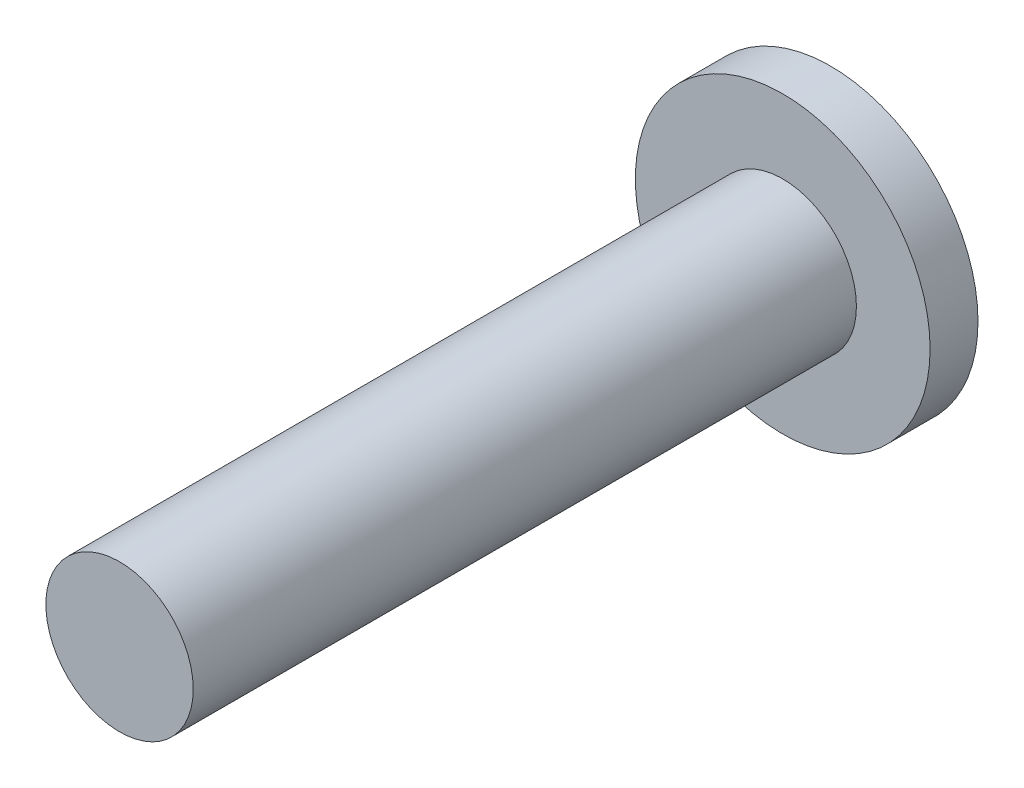
ISO-10303-21;
HEADER;
FILE_DESCRIPTION(('STEP AP214'),'2;1');
FILE_NAME('part.step','',(''),(''),'','','');
FILE_SCHEMA(('AUTOMOTIVE_DESIGN { 1 0 10303 214 1 1 1 1 }'));
ENDSEC;
DATA;
#1=APPLICATION_CONTEXT('core data for automotive mechanical design processes');
#2=APPLICATION_PROTOCOL_DEFINITION('international standard','automotive_design',2000,#1);
#3=PRODUCT_CONTEXT('',#1,'mechanical');
#4=PRODUCT('Part','Part','',(#3));
#5=PRODUCT_RELATED_PRODUCT_CATEGORY('part','',(#4));
#6=PRODUCT_DEFINITION_FORMATION('','',#4);
#7=PRODUCT_DEFINITION_CONTEXT('part definition',#1,'design');
#8=PRODUCT_DEFINITION('design','',#6,#7);
#9=PRODUCT_DEFINITION_SHAPE('','',#8);
#10=(LENGTH_UNIT() NAMED_UNIT(*) SI_UNIT(.MILLI.,.METRE.));
#11=(NAMED_UNIT(*) PLANE_ANGLE_UNIT() SI_UNIT($,.RADIAN.));
#12=(NAMED_UNIT(*) SI_UNIT($,.STERADIAN.) SOLID_ANGLE_UNIT());
#13=UNCERTAINTY_MEASURE_WITH_UNIT(LENGTH_MEASURE(1.E-05),#10,'distance_accuracy_value','');
#14=(GEOMETRIC_REPRESENTATION_CONTEXT(3) GLOBAL_UNCERTAINTY_ASSIGNED_CONTEXT((#13)) GLOBAL_UNIT_ASSIGNED_CONTEXT((#10,
#11,#12)) REPRESENTATION_CONTEXT('',''));
#15=CARTESIAN_POINT('',(0.,0.,0.));
#16=DIRECTION('',(0.,0.,1.));
#17=DIRECTION('',(1.,0.,0.));
#18=AXIS2_PLACEMENT_3D('',#15,#16,#17);
#19=CARTESIAN_POINT('',(0.,0.,1.3));
#20=DIRECTION('',(0.,0.,-1.));
#21=DIRECTION('',(-1.,0.,0.));
#22=AXIS2_PLACEMENT_3D('',#19,#20,#21);
#23=CYLINDRICAL_SURFACE('',#22,4.);
#24=CARTESIAN_POINT('',(0.,0.,1.3));
#25=DIRECTION('',(0.,0.,1.));
#26=DIRECTION('',(1.,0.,0.));
#27=AXIS2_PLACEMENT_3D('',#24,#25,#26);
#28=CIRCLE('',#27,4.);
#29=CARTESIAN_POINT('',(4.,0.,1.3));
#30=VERTEX_POINT('',#29);
#31=EDGE_CURVE('E48',#30,#30,#28,.T.);
#32=ORIENTED_EDGE('',*,*,#31,.F.);
#33=EDGE_LOOP('',(#32));
#34=FACE_BOUND('',#33,.T.);
#35=CARTESIAN_POINT('',(0.,0.,0.));
#36=DIRECTION('',(0.,0.,1.));
#37=DIRECTION('',(1.,0.,0.));
#38=AXIS2_PLACEMENT_3D('',#35,#36,#37);
#39=CIRCLE('',#38,4.);
#40=CARTESIAN_POINT('',(4.,0.,0.));
#41=VERTEX_POINT('',#40);
#42=EDGE_CURVE('E43',#41,#41,#39,.T.);
#43=ORIENTED_EDGE('',*,*,#42,.T.);
#44=EDGE_LOOP('',(#43));
#45=FACE_BOUND('',#44,.T.);
#46=ADVANCED_FACE('F40',(#34,#45),#23,.T.);
#47=CARTESIAN_POINT('',(0.,0.,1.3));
#48=DIRECTION('',(0.,0.,1.));
#49=DIRECTION('',(1.,0.,0.));
#50=AXIS2_PLACEMENT_3D('',#47,#48,#49);
#51=PLANE('',#50);
#52=CARTESIAN_POINT('',(0.,0.,1.3));
#53=DIRECTION('',(0.,0.,1.));
#54=DIRECTION('',(1.,0.,0.));
#55=AXIS2_PLACEMENT_3D('',#52,#53,#54);
#56=CIRCLE('',#55,2.);
#57=CARTESIAN_POINT('',(2.,0.,1.3));
#58=VERTEX_POINT('',#57);
#59=EDGE_CURVE('E11',#58,#58,#56,.T.);
#60=ORIENTED_EDGE('',*,*,#59,.F.);
#61=EDGE_LOOP('',(#60));
#62=FACE_BOUND('',#61,.T.);
#63=ORIENTED_EDGE('',*,*,#31,.T.);
#64=EDGE_LOOP('',(#63));
#65=FACE_BOUND('',#64,.T.);
#66=ADVANCED_FACE('F160',(#62,#65),#51,.T.);
#67=CARTESIAN_POINT('',(0.,0.,0.));
#68=DIRECTION('',(0.,0.,1.));
#69=DIRECTION('',(1.,0.,0.));
#70=AXIS2_PLACEMENT_3D('',#67,#68,#69);
#71=PLANE('',#70);
#72=DIRECTION('',(0.5,0.866025403784439,0.));
#73=VECTOR('',#72,1.);
#74=CARTESIAN_POINT('',(-1.44337567297406,0.,0.));
#75=LINE('',#74,#73);
#76=CARTESIAN_POINT('',(-1.44337567297406,0.,0.));
#77=VERTEX_POINT('',#76);
#78=CARTESIAN_POINT('',(-0.721687836487032,1.25,0.));
#79=VERTEX_POINT('',#78);
#80=EDGE_CURVE('E130',#77,#79,#75,.T.);
#81=ORIENTED_EDGE('',*,*,#80,.F.);
#82=DIRECTION('',(-0.5,0.866025403784439,0.));
#83=VECTOR('',#82,1.);
#84=CARTESIAN_POINT('',(-0.721687836487032,-1.25,0.));
#85=LINE('',#84,#83);
#86=CARTESIAN_POINT('',(-0.721687836487032,-1.25,0.));
#87=VERTEX_POINT('',#86);
#88=EDGE_CURVE('E56',#87,#77,#85,.T.);
#89=ORIENTED_EDGE('',*,*,#88,.F.);
#90=DIRECTION('',(-1.,0.,0.));
#91=VECTOR('',#90,1.);
#92=CARTESIAN_POINT('',(0.721687836487033,-1.25,0.));
#93=LINE('',#92,#91);
#94=CARTESIAN_POINT('',(0.721687836487033,-1.25,0.));
#95=VERTEX_POINT('',#94);
#96=EDGE_CURVE('E139',#95,#87,#93,.T.);
#97=ORIENTED_EDGE('',*,*,#96,.F.);
#98=DIRECTION('',(-0.5,-0.866025403784439,0.));
#99=VECTOR('',#98,1.);
#100=CARTESIAN_POINT('',(1.44337567297406,0.,0.));
#101=LINE('',#100,#99);
#102=CARTESIAN_POINT('',(1.44337567297406,0.,0.));
#103=VERTEX_POINT('',#102);
#104=EDGE_CURVE('E137',#103,#95,#101,.T.);
#105=ORIENTED_EDGE('',*,*,#104,.F.);
#106=DIRECTION('',(0.5,-0.866025403784439,0.));
#107=VECTOR('',#106,1.);
#108=CARTESIAN_POINT('',(0.721687836487033,1.25,0.));
#109=LINE('',#108,#107);
#110=CARTESIAN_POINT('',(0.721687836487033,1.25,0.));
#111=VERTEX_POINT('',#110);
#112=EDGE_CURVE('E104',#111,#103,#109,.T.);
#113=ORIENTED_EDGE('',*,*,#112,.F.);
#114=DIRECTION('',(1.,0.,0.));
#115=VECTOR('',#114,1.);
#116=CARTESIAN_POINT('',(-0.721687836487032,1.25,0.));
#117=LINE('',#116,#115);
#118=EDGE_CURVE('E133',#79,#111,#117,.T.);
#119=ORIENTED_EDGE('',*,*,#118,.F.);
#120=EDGE_LOOP('',(#81,#89,#97,#105,#113,#119));
#121=FACE_BOUND('',#120,.T.);
#122=ORIENTED_EDGE('',*,*,#42,.F.);
#123=EDGE_LOOP('',(#122));
#124=FACE_BOUND('',#123,.T.);
#125=ADVANCED_FACE('F157',(#121,#124),#71,.F.);
#126=CARTESIAN_POINT('',(0.,0.,19.3));
#127=DIRECTION('',(0.,0.,-1.));
#128=DIRECTION('',(-1.,0.,0.));
#129=AXIS2_PLACEMENT_3D('',#126,#127,#128);
#130=CYLINDRICAL_SURFACE('',#129,2.);
#131=CARTESIAN_POINT('',(0.,0.,19.3));
#132=DIRECTION('',(0.,0.,1.));
#133=DIRECTION('',(1.,0.,0.));
#134=AXIS2_PLACEMENT_3D('',#131,#132,#133);
#135=CIRCLE('',#134,2.);
#136=CARTESIAN_POINT('',(2.,0.,19.3));
#137=VERTEX_POINT('',#136);
#138=EDGE_CURVE('E143',#137,#137,#135,.T.);
#139=ORIENTED_EDGE('',*,*,#138,.F.);
#140=EDGE_LOOP('',(#139));
#141=FACE_BOUND('',#140,.T.);
#142=ORIENTED_EDGE('',*,*,#59,.T.);
#143=EDGE_LOOP('',(#142));
#144=FACE_BOUND('',#143,.T.);
#145=ADVANCED_FACE('F159',(#141,#144),#130,.T.);
#146=CARTESIAN_POINT('',(0.,0.,19.3));
#147=DIRECTION('',(0.,0.,1.));
#148=DIRECTION('',(1.,0.,0.));
#149=AXIS2_PLACEMENT_3D('',#146,#147,#148);
#150=PLANE('',#149);
#151=ORIENTED_EDGE('',*,*,#138,.T.);
#152=EDGE_LOOP('',(#151));
#153=FACE_BOUND('',#152,.T.);
#154=ADVANCED_FACE('F167',(#153),#150,.T.);
#155=CARTESIAN_POINT('',(-0.721687836487032,-1.25,1.));
#156=DIRECTION('',(-0.866025403784439,-0.5,0.));
#157=DIRECTION('',(0.5,-0.866025403784439,0.));
#158=AXIS2_PLACEMENT_3D('',#155,#156,#157);
#159=PLANE('',#158);
#160=ORIENTED_EDGE('',*,*,#88,.T.);
#161=DIRECTION('',(0.,0.,-1.));
#162=VECTOR('',#161,1.);
#163=CARTESIAN_POINT('',(-1.44337567297406,0.,1.));
#164=LINE('',#163,#162);
#165=CARTESIAN_POINT('',(-1.44337567297406,0.,1.));
#166=VERTEX_POINT('',#165);
#167=EDGE_CURVE('E86',#166,#77,#164,.T.);
#168=ORIENTED_EDGE('',*,*,#167,.F.);
#169=DIRECTION('',(-0.5,0.866025403784439,0.));
#170=VECTOR('',#169,1.);
#171=CARTESIAN_POINT('',(-0.721687836487032,-1.25,1.));
#172=LINE('',#171,#170);
#173=CARTESIAN_POINT('',(-0.721687836487032,-1.25,1.));
#174=VERTEX_POINT('',#173);
#175=EDGE_CURVE('E141',#174,#166,#172,.T.);
#176=ORIENTED_EDGE('',*,*,#175,.F.);
#177=DIRECTION('',(0.,0.,-1.));
#178=VECTOR('',#177,1.);
#179=CARTESIAN_POINT('',(-0.721687836487032,-1.25,1.));
#180=LINE('',#179,#178);
#181=EDGE_CURVE('E64',#174,#87,#180,.T.);
#182=ORIENTED_EDGE('',*,*,#181,.T.);
#183=EDGE_LOOP('',(#160,#168,#176,#182));
#184=FACE_BOUND('',#183,.T.);
#185=ADVANCED_FACE('F193',(#184),#159,.F.);
#186=CARTESIAN_POINT('',(0.721687836487033,-1.25,1.));
#187=DIRECTION('',(0.,-1.,0.));
#188=DIRECTION('',(0.,0.,-1.));
#189=AXIS2_PLACEMENT_3D('',#186,#187,#188);
#190=PLANE('',#189);
#191=ORIENTED_EDGE('',*,*,#96,.T.);
#192=ORIENTED_EDGE('',*,*,#181,.F.);
#193=DIRECTION('',(-1.,0.,0.));
#194=VECTOR('',#193,1.);
#195=CARTESIAN_POINT('',(0.721687836487033,-1.25,1.));
#196=LINE('',#195,#194);
#197=CARTESIAN_POINT('',(0.721687836487033,-1.25,1.));
#198=VERTEX_POINT('',#197);
#199=EDGE_CURVE('E116',#198,#174,#196,.T.);
#200=ORIENTED_EDGE('',*,*,#199,.F.);
#201=DIRECTION('',(0.,0.,-1.));
#202=VECTOR('',#201,1.);
#203=CARTESIAN_POINT('',(0.721687836487033,-1.25,1.));
#204=LINE('',#203,#202);
#205=EDGE_CURVE('E108',#198,#95,#204,.T.);
#206=ORIENTED_EDGE('',*,*,#205,.T.);
#207=EDGE_LOOP('',(#191,#192,#200,#206));
#208=FACE_BOUND('',#207,.T.);
#209=ADVANCED_FACE('F205',(#208),#190,.F.);
#210=CARTESIAN_POINT('',(1.44337567297406,0.,1.));
#211=DIRECTION('',(0.866025403784439,-0.5,0.));
#212=DIRECTION('',(0.5,0.866025403784439,0.));
#213=AXIS2_PLACEMENT_3D('',#210,#211,#212);
#214=PLANE('',#213);
#215=ORIENTED_EDGE('',*,*,#104,.T.);
#216=ORIENTED_EDGE('',*,*,#205,.F.);
#217=DIRECTION('',(-0.5,-0.866025403784439,0.));
#218=VECTOR('',#217,1.);
#219=CARTESIAN_POINT('',(1.44337567297406,0.,1.));
#220=LINE('',#219,#218);
#221=CARTESIAN_POINT('',(1.44337567297406,0.,1.));
#222=VERTEX_POINT('',#221);
#223=EDGE_CURVE('E112',#222,#198,#220,.T.);
#224=ORIENTED_EDGE('',*,*,#223,.F.);
#225=DIRECTION('',(0.,0.,-1.));
#226=VECTOR('',#225,1.);
#227=CARTESIAN_POINT('',(1.44337567297406,0.,1.));
#228=LINE('',#227,#226);
#229=EDGE_CURVE('E97',#222,#103,#228,.T.);
#230=ORIENTED_EDGE('',*,*,#229,.T.);
#231=EDGE_LOOP('',(#215,#216,#224,#230));
#232=FACE_BOUND('',#231,.T.);
#233=ADVANCED_FACE('F113',(#232),#214,.F.);
#234=CARTESIAN_POINT('',(0.721687836487033,1.25,1.));
#235=DIRECTION('',(0.866025403784439,0.5,0.));
#236=DIRECTION('',(-0.5,0.866025403784439,0.));
#237=AXIS2_PLACEMENT_3D('',#234,#235,#236);
#238=PLANE('',#237);
#239=ORIENTED_EDGE('',*,*,#112,.T.);
#240=ORIENTED_EDGE('',*,*,#229,.F.);
#241=DIRECTION('',(0.5,-0.866025403784439,0.));
#242=VECTOR('',#241,1.);
#243=CARTESIAN_POINT('',(0.721687836487033,1.25,1.));
#244=LINE('',#243,#242);
#245=CARTESIAN_POINT('',(0.721687836487033,1.25,1.));
#246=VERTEX_POINT('',#245);
#247=EDGE_CURVE('E101',#246,#222,#244,.T.);
#248=ORIENTED_EDGE('',*,*,#247,.F.);
#249=DIRECTION('',(0.,0.,-1.));
#250=VECTOR('',#249,1.);
#251=CARTESIAN_POINT('',(0.721687836487033,1.25,1.));
#252=LINE('',#251,#250);
#253=EDGE_CURVE('E109',#246,#111,#252,.T.);
#254=ORIENTED_EDGE('',*,*,#253,.T.);
#255=EDGE_LOOP('',(#239,#240,#248,#254));
#256=FACE_BOUND('',#255,.T.);
#257=ADVANCED_FACE('F99',(#256),#238,.F.);
#258=CARTESIAN_POINT('',(-0.721687836487032,1.25,1.));
#259=DIRECTION('',(0.,1.,0.));
#260=DIRECTION('',(0.,0.,1.));
#261=AXIS2_PLACEMENT_3D('',#258,#259,#260);
#262=PLANE('',#261);
#263=ORIENTED_EDGE('',*,*,#118,.T.);
#264=ORIENTED_EDGE('',*,*,#253,.F.);
#265=DIRECTION('',(1.,0.,0.));
#266=VECTOR('',#265,1.);
#267=CARTESIAN_POINT('',(-0.721687836487032,1.25,1.));
#268=LINE('',#267,#266);
#269=CARTESIAN_POINT('',(-0.721687836487032,1.25,1.));
#270=VERTEX_POINT('',#269);
#271=EDGE_CURVE('E122',#270,#246,#268,.T.);
#272=ORIENTED_EDGE('',*,*,#271,.F.);
#273=DIRECTION('',(0.,0.,-1.));
#274=VECTOR('',#273,1.);
#275=CARTESIAN_POINT('',(-0.721687836487032,1.25,1.));
#276=LINE('',#275,#274);
#277=EDGE_CURVE('E146',#270,#79,#276,.T.);
#278=ORIENTED_EDGE('',*,*,#277,.T.);
#279=EDGE_LOOP('',(#263,#264,#272,#278));
#280=FACE_BOUND('',#279,.T.);
#281=ADVANCED_FACE('F230',(#280),#262,.F.);
#282=CARTESIAN_POINT('',(-1.44337567297406,0.,1.));
#283=DIRECTION('',(-0.866025403784439,0.5,0.));
#284=DIRECTION('',(-0.5,-0.866025403784439,0.));
#285=AXIS2_PLACEMENT_3D('',#282,#283,#284);
#286=PLANE('',#285);
#287=ORIENTED_EDGE('',*,*,#80,.T.);
#288=ORIENTED_EDGE('',*,*,#277,.F.);
#289=DIRECTION('',(0.5,0.866025403784439,0.));
#290=VECTOR('',#289,1.);
#291=CARTESIAN_POINT('',(-1.44337567297406,0.,1.));
#292=LINE('',#291,#290);
#293=EDGE_CURVE('E124',#166,#270,#292,.T.);
#294=ORIENTED_EDGE('',*,*,#293,.F.);
#295=ORIENTED_EDGE('',*,*,#167,.T.);
#296=EDGE_LOOP('',(#287,#288,#294,#295));
#297=FACE_BOUND('',#296,.T.);
#298=ADVANCED_FACE('F239',(#297),#286,.F.);
#299=CARTESIAN_POINT('',(0.,0.,1.));
#300=DIRECTION('',(0.,0.,-1.));
#301=DIRECTION('',(-1.,0.,0.));
#302=AXIS2_PLACEMENT_3D('',#299,#300,#301);
#303=PLANE('',#302);
#304=ORIENTED_EDGE('',*,*,#175,.T.);
#305=ORIENTED_EDGE('',*,*,#293,.T.);
#306=ORIENTED_EDGE('',*,*,#271,.T.);
#307=ORIENTED_EDGE('',*,*,#247,.T.);
#308=ORIENTED_EDGE('',*,*,#223,.T.);
#309=ORIENTED_EDGE('',*,*,#199,.T.);
#310=EDGE_LOOP('',(#304,#305,#306,#307,#308,#309));
#311=FACE_BOUND('',#310,.T.);
#312=ADVANCED_FACE('F119',(#311),#303,.T.);
#313=CLOSED_SHELL('',(#46,#66,#125,#145,#154,#185,#209,#233,#257,#281,#298,#312));
#314=MANIFOLD_SOLID_BREP('B2',#313);
#315=ADVANCED_BREP_SHAPE_REPRESENTATION('',(#18,#314),#14);
#316=SHAPE_DEFINITION_REPRESENTATION(#9,#315);
ENDSEC;
END-ISO-10303-21;
